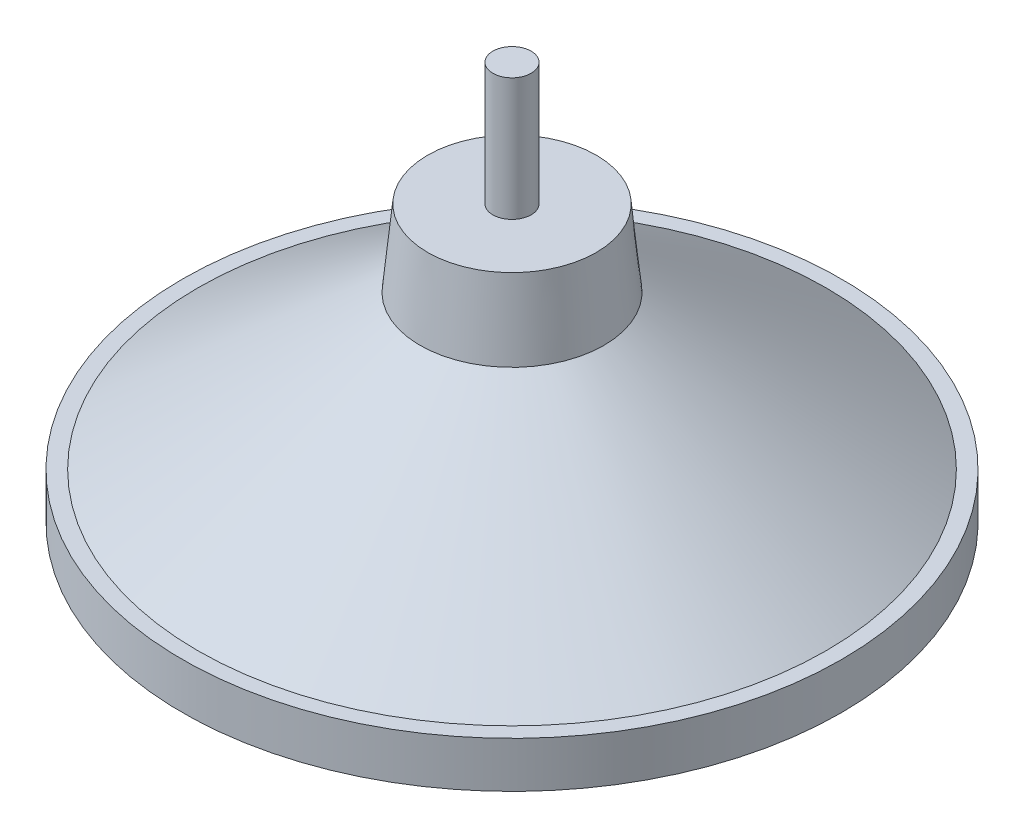
ISO-10303-21;
HEADER;
FILE_DESCRIPTION(('STEP AP214'),'2;1');
FILE_NAME('part.step','',(''),(''),'','','');
FILE_SCHEMA(('AUTOMOTIVE_DESIGN { 1 0 10303 214 1 1 1 1 }'));
ENDSEC;
DATA;
#1=APPLICATION_CONTEXT('core data for automotive mechanical design processes');
#2=APPLICATION_PROTOCOL_DEFINITION('international standard','automotive_design',2000,#1);
#3=PRODUCT_CONTEXT('',#1,'mechanical');
#4=PRODUCT('Part','Part','',(#3));
#5=PRODUCT_RELATED_PRODUCT_CATEGORY('part','',(#4));
#6=PRODUCT_DEFINITION_FORMATION('','',#4);
#7=PRODUCT_DEFINITION_CONTEXT('part definition',#1,'design');
#8=PRODUCT_DEFINITION('design','',#6,#7);
#9=PRODUCT_DEFINITION_SHAPE('','',#8);
#10=(LENGTH_UNIT() NAMED_UNIT(*) SI_UNIT(.MILLI.,.METRE.));
#11=(NAMED_UNIT(*) PLANE_ANGLE_UNIT() SI_UNIT($,.RADIAN.));
#12=(NAMED_UNIT(*) SI_UNIT($,.STERADIAN.) SOLID_ANGLE_UNIT());
#13=UNCERTAINTY_MEASURE_WITH_UNIT(LENGTH_MEASURE(1.E-05),#10,'distance_accuracy_value','');
#14=(GEOMETRIC_REPRESENTATION_CONTEXT(3) GLOBAL_UNCERTAINTY_ASSIGNED_CONTEXT((#13)) GLOBAL_UNIT_ASSIGNED_CONTEXT((#10,
#11,#12)) REPRESENTATION_CONTEXT('',''));
#15=CARTESIAN_POINT('',(0.,0.,0.));
#16=DIRECTION('',(0.,0.,1.));
#17=DIRECTION('',(1.,0.,0.));
#18=AXIS2_PLACEMENT_3D('',#15,#16,#17);
#19=CARTESIAN_POINT('',(0.,0.,0.));
#20=DIRECTION('',(0.,1.,0.));
#21=DIRECTION('',(-1.,0.,0.));
#22=AXIS2_PLACEMENT_3D('',#19,#20,#21);
#23=PLANE('',#22);
#24=CARTESIAN_POINT('',(0.,0.,0.));
#25=DIRECTION('',(0.,1.,0.));
#26=DIRECTION('',(-1.,0.,0.));
#27=AXIS2_PLACEMENT_3D('',#24,#25,#26);
#28=CIRCLE('',#27,68.2625);
#29=CARTESIAN_POINT('',(-68.2625,0.,0.));
#30=VERTEX_POINT('',#29);
#31=EDGE_CURVE('E10',#30,#30,#28,.T.);
#32=ORIENTED_EDGE('',*,*,#31,.F.);
#33=EDGE_LOOP('',(#32));
#34=FACE_BOUND('',#33,.T.);
#35=ADVANCED_FACE('F32',(#34),#23,.F.);
#36=CARTESIAN_POINT('',(0.,57.15,0.));
#37=DIRECTION('',(0.,1.,0.));
#38=DIRECTION('',(-1.,0.,0.));
#39=AXIS2_PLACEMENT_3D('',#36,#37,#38);
#40=CYLINDRICAL_SURFACE('',#39,68.2625);
#41=CARTESIAN_POINT('',(0.,9.525,0.));
#42=DIRECTION('',(0.,1.,0.));
#43=DIRECTION('',(-1.,0.,0.));
#44=AXIS2_PLACEMENT_3D('',#41,#42,#43);
#45=CIRCLE('',#44,68.2625);
#46=CARTESIAN_POINT('',(-68.2625,9.525,0.));
#47=VERTEX_POINT('',#46);
#48=EDGE_CURVE('E38',#47,#47,#45,.T.);
#49=ORIENTED_EDGE('',*,*,#48,.F.);
#50=EDGE_LOOP('',(#49));
#51=FACE_BOUND('',#50,.T.);
#52=ORIENTED_EDGE('',*,*,#31,.T.);
#53=EDGE_LOOP('',(#52));
#54=FACE_BOUND('',#53,.T.);
#55=ADVANCED_FACE('F89',(#51,#54),#40,.T.);
#56=CARTESIAN_POINT('',(68.2625,9.525,0.));
#57=DIRECTION('',(0.,-1.,0.));
#58=DIRECTION('',(1.,0.,0.));
#59=AXIS2_PLACEMENT_3D('',#56,#57,#58);
#60=PLANE('',#59);
#61=CARTESIAN_POINT('',(0.,9.525,0.));
#62=DIRECTION('',(0.,1.,0.));
#63=DIRECTION('',(-1.,0.,0.));
#64=AXIS2_PLACEMENT_3D('',#61,#62,#63);
#65=CIRCLE('',#64,65.0875);
#66=CARTESIAN_POINT('',(65.0875,9.525,0.));
#67=VERTEX_POINT('',#66);
#68=EDGE_CURVE('E42',#67,#67,#65,.T.);
#69=ORIENTED_EDGE('',*,*,#68,.F.);
#70=EDGE_LOOP('',(#69));
#71=FACE_BOUND('',#70,.T.);
#72=ORIENTED_EDGE('',*,*,#48,.T.);
#73=EDGE_LOOP('',(#72));
#74=FACE_BOUND('',#73,.T.);
#75=ADVANCED_FACE('F84',(#71,#74),#60,.F.);
#76=CARTESIAN_POINT('',(0.,9.525,0.));
#77=DIRECTION('',(0.,-1.,0.));
#78=DIRECTION('',(1.,0.,0.));
#79=AXIS2_PLACEMENT_3D('',#76,#77,#78);
#80=CONICAL_SURFACE('',#79,65.0875,0.96704699339746);
#81=CARTESIAN_POINT('',(0.,41.275,0.));
#82=DIRECTION('',(0.,1.,0.));
#83=DIRECTION('',(-1.,0.,0.));
#84=AXIS2_PLACEMENT_3D('',#81,#82,#83);
#85=CIRCLE('',#84,19.05);
#86=CARTESIAN_POINT('',(19.05,41.275,0.));
#87=VERTEX_POINT('',#86);
#88=EDGE_CURVE('E46',#87,#87,#85,.T.);
#89=CARTESIAN_POINT('',(19.05,41.275,0.));
#90=CARTESIAN_POINT('',(19.5295572916667,40.9442708333333,0.));
#91=CARTESIAN_POINT('',(20.0091145833333,40.6135416666667,0.));
#92=CARTESIAN_POINT('',(20.9682291666667,39.9520833333333,0.));
#93=CARTESIAN_POINT('',(21.4477864583333,39.6213541666666,0.));
#94=CARTESIAN_POINT('',(22.4069010416667,38.9598958333333,0.));
#95=CARTESIAN_POINT('',(22.8864583333333,38.6291666666667,0.));
#96=CARTESIAN_POINT('',(23.8455729166667,37.9677083333333,0.));
#97=CARTESIAN_POINT('',(24.3251302083333,37.6369791666667,0.));
#98=CARTESIAN_POINT('',(25.2842447916667,36.9755208333333,0.));
#99=CARTESIAN_POINT('',(25.7638020833333,36.6447916666667,0.));
#100=CARTESIAN_POINT('',(26.7229166666667,35.9833333333333,0.));
#101=CARTESIAN_POINT('',(27.2024739583333,35.6526041666667,0.));
#102=CARTESIAN_POINT('',(28.1615885416667,34.9911458333333,0.));
#103=CARTESIAN_POINT('',(28.6411458333333,34.6604166666667,0.));
#104=CARTESIAN_POINT('',(29.6002604166667,33.9989583333333,0.));
#105=CARTESIAN_POINT('',(30.0798177083333,33.6682291666667,0.));
#106=CARTESIAN_POINT('',(31.0389322916667,33.0067708333333,0.));
#107=CARTESIAN_POINT('',(31.5184895833333,32.6760416666667,0.));
#108=CARTESIAN_POINT('',(32.4776041666667,32.0145833333333,0.));
#109=CARTESIAN_POINT('',(32.9571614583333,31.6838541666667,0.));
#110=CARTESIAN_POINT('',(33.9162760416667,31.0223958333333,0.));
#111=CARTESIAN_POINT('',(34.3958333333333,30.6916666666667,0.));
#112=CARTESIAN_POINT('',(35.3549479166667,30.0302083333333,0.));
#113=CARTESIAN_POINT('',(35.8345052083333,29.6994791666667,0.));
#114=CARTESIAN_POINT('',(36.7936197916667,29.0380208333333,0.));
#115=CARTESIAN_POINT('',(37.2731770833333,28.7072916666667,0.));
#116=CARTESIAN_POINT('',(38.2322916666667,28.0458333333333,0.));
#117=CARTESIAN_POINT('',(38.7118489583333,27.7151041666667,0.));
#118=CARTESIAN_POINT('',(39.6709635416667,27.0536458333333,0.));
#119=CARTESIAN_POINT('',(40.1505208333333,26.7229166666667,0.));
#120=CARTESIAN_POINT('',(41.1096354166667,26.0614583333333,0.));
#121=CARTESIAN_POINT('',(41.5891927083333,25.7307291666667,0.));
#122=CARTESIAN_POINT('',(42.5483072916667,25.0692708333333,0.));
#123=CARTESIAN_POINT('',(43.0278645833333,24.7385416666667,0.));
#124=CARTESIAN_POINT('',(43.9869791666667,24.0770833333333,0.));
#125=CARTESIAN_POINT('',(44.4665364583333,23.7463541666667,0.));
#126=CARTESIAN_POINT('',(45.4256510416667,23.0848958333333,0.));
#127=CARTESIAN_POINT('',(45.9052083333333,22.7541666666667,0.));
#128=CARTESIAN_POINT('',(46.8643229166667,22.0927083333333,0.));
#129=CARTESIAN_POINT('',(47.3438802083333,21.7619791666667,0.));
#130=CARTESIAN_POINT('',(48.3029947916667,21.1005208333333,0.));
#131=CARTESIAN_POINT('',(48.7825520833333,20.7697916666667,0.));
#132=CARTESIAN_POINT('',(49.7416666666667,20.1083333333333,0.));
#133=CARTESIAN_POINT('',(50.2212239583333,19.7776041666667,0.));
#134=CARTESIAN_POINT('',(51.1803385416667,19.1161458333333,0.));
#135=CARTESIAN_POINT('',(51.6598958333333,18.7854166666667,0.));
#136=CARTESIAN_POINT('',(52.6190104166667,18.1239583333333,0.));
#137=CARTESIAN_POINT('',(53.0985677083333,17.7932291666667,0.));
#138=CARTESIAN_POINT('',(54.0576822916667,17.1317708333333,0.));
#139=CARTESIAN_POINT('',(54.5372395833333,16.8010416666667,0.));
#140=CARTESIAN_POINT('',(55.4963541666667,16.1395833333333,0.));
#141=CARTESIAN_POINT('',(55.9759114583333,15.8088541666667,0.));
#142=CARTESIAN_POINT('',(56.9350260416667,15.1473958333333,0.));
#143=CARTESIAN_POINT('',(57.4145833333333,14.8166666666667,0.));
#144=CARTESIAN_POINT('',(58.3736979166667,14.1552083333333,0.));
#145=CARTESIAN_POINT('',(58.8532552083333,13.8244791666667,0.));
#146=CARTESIAN_POINT('',(59.8123697916667,13.1630208333333,0.));
#147=CARTESIAN_POINT('',(60.2919270833333,12.8322916666667,0.));
#148=CARTESIAN_POINT('',(61.2510416666667,12.1708333333333,0.));
#149=CARTESIAN_POINT('',(61.7305989583333,11.8401041666667,0.));
#150=CARTESIAN_POINT('',(62.6897135416667,11.1786458333333,0.));
#151=CARTESIAN_POINT('',(63.1692708333333,10.8479166666667,0.));
#152=CARTESIAN_POINT('',(64.1283854166667,10.1864583333333,0.));
#153=CARTESIAN_POINT('',(64.6079427083333,9.85572916666667,0.));
#154=CARTESIAN_POINT('',(65.0875,9.525,0.));
#155=B_SPLINE_CURVE_WITH_KNOTS('',3,(#89,#90,#91,#92,#93,#94,#95,#96,#97,#98,#99,#100,#101,#102,
#103,#104,#105,#106,#107,#108,#109,#110,#111,#112,#113,#114,#115,#116,#117,#118,#119,#120,#121,
#122,#123,#124,#125,#126,#127,#128,#129,#130,#131,#132,#133,#134,#135,#136,#137,#138,#139,#140,
#141,#142,#143,#144,#145,#146,#147,#148,#149,#150,#151,#152,#153,#154),.UNSPECIFIED.,.F.,.F.,(4,
2,2,2,2,2,2,2,2,2,2,2,2,2,2,2,2,2,2,2,2,2,2,2,2,2,2,2,2,2,2,2,4),(0.,1.74763062432319,
3.49526124864639,5.24289187296957,6.99052249729276,8.73815312161595,10.4857837459391,
12.2334143702623,13.9810449945855,15.7286756189087,17.4763062432319,19.2239368675551,
20.9715674918783,22.7191981162015,24.4668287405247,26.2144593648479,27.962089989171,
29.7097206134942,31.4573512378174,33.2049818621406,34.9526124864638,36.700243110787,
38.4478737351102,40.1955043594334,41.9431349837566,43.6907656080798,45.438396232403,
47.1860268567262,48.9336574810493,50.6812881053725,52.4289187296957,54.1765493540189,
55.9241799783421),.UNSPECIFIED.);
#156=EDGE_CURVE('BSEAM78',#87,#67,#155,.T.);
#157=ORIENTED_EDGE('',*,*,#88,.F.);
#158=ORIENTED_EDGE('',*,*,#68,.T.);
#159=ORIENTED_EDGE('',*,*,#156,.T.);
#160=ORIENTED_EDGE('',*,*,#156,.F.);
#161=EDGE_LOOP('',(#157,#159,#158,#160));
#162=FACE_BOUND('',#161,.T.);
#163=ADVANCED_FACE('F78',(#162),#80,.T.);
#164=CARTESIAN_POINT('',(0.,41.275,0.));
#165=DIRECTION('',(0.,-1.,0.));
#166=DIRECTION('',(1.,0.,0.));
#167=AXIS2_PLACEMENT_3D('',#164,#165,#166);
#168=CONICAL_SURFACE('',#167,19.05,0.0996686524911621);
#169=CARTESIAN_POINT('',(0.,57.15,0.));
#170=DIRECTION('',(0.,1.,0.));
#171=DIRECTION('',(-1.,0.,0.));
#172=AXIS2_PLACEMENT_3D('',#169,#170,#171);
#173=CIRCLE('',#172,17.4625);
#174=CARTESIAN_POINT('',(-17.4625,57.15,0.));
#175=VERTEX_POINT('',#174);
#176=EDGE_CURVE('E51',#175,#175,#173,.T.);
#177=ORIENTED_EDGE('',*,*,#176,.F.);
#178=EDGE_LOOP('',(#177));
#179=FACE_BOUND('',#178,.T.);
#180=ORIENTED_EDGE('',*,*,#88,.T.);
#181=EDGE_LOOP('',(#180));
#182=FACE_BOUND('',#181,.T.);
#183=ADVANCED_FACE('F72',(#179,#182),#168,.T.);
#184=CARTESIAN_POINT('',(17.4625,57.15,0.));
#185=DIRECTION('',(0.,-1.,0.));
#186=DIRECTION('',(1.,0.,0.));
#187=AXIS2_PLACEMENT_3D('',#184,#185,#186);
#188=PLANE('',#187);
#189=CARTESIAN_POINT('',(0.,57.15,0.));
#190=DIRECTION('',(0.,1.,0.));
#191=DIRECTION('',(-1.,0.,0.));
#192=AXIS2_PLACEMENT_3D('',#189,#190,#191);
#193=CIRCLE('',#192,3.96875);
#194=CARTESIAN_POINT('',(-3.96875,57.15,0.));
#195=VERTEX_POINT('',#194);
#196=EDGE_CURVE('E54',#195,#195,#193,.T.);
#197=ORIENTED_EDGE('',*,*,#196,.F.);
#198=EDGE_LOOP('',(#197));
#199=FACE_BOUND('',#198,.T.);
#200=ORIENTED_EDGE('',*,*,#176,.T.);
#201=EDGE_LOOP('',(#200));
#202=FACE_BOUND('',#201,.T.);
#203=ADVANCED_FACE('F66',(#199,#202),#188,.F.);
#204=CARTESIAN_POINT('',(0.,57.15,0.));
#205=DIRECTION('',(0.,1.,0.));
#206=DIRECTION('',(-1.,0.,0.));
#207=AXIS2_PLACEMENT_3D('',#204,#205,#206);
#208=CYLINDRICAL_SURFACE('',#207,3.96875);
#209=CARTESIAN_POINT('',(0.,82.55,0.));
#210=DIRECTION('',(0.,1.,0.));
#211=DIRECTION('',(-1.,0.,0.));
#212=AXIS2_PLACEMENT_3D('',#209,#210,#211);
#213=CIRCLE('',#212,3.96875);
#214=CARTESIAN_POINT('',(-3.96875,82.55,0.));
#215=VERTEX_POINT('',#214);
#216=EDGE_CURVE('E57',#215,#215,#213,.T.);
#217=ORIENTED_EDGE('',*,*,#216,.F.);
#218=EDGE_LOOP('',(#217));
#219=FACE_BOUND('',#218,.T.);
#220=ORIENTED_EDGE('',*,*,#196,.T.);
#221=EDGE_LOOP('',(#220));
#222=FACE_BOUND('',#221,.T.);
#223=ADVANCED_FACE('F63',(#219,#222),#208,.T.);
#224=CARTESIAN_POINT('',(3.96875,82.55,0.));
#225=DIRECTION('',(0.,-1.,0.));
#226=DIRECTION('',(1.,0.,0.));
#227=AXIS2_PLACEMENT_3D('',#224,#225,#226);
#228=PLANE('',#227);
#229=ORIENTED_EDGE('',*,*,#216,.T.);
#230=EDGE_LOOP('',(#229));
#231=FACE_BOUND('',#230,.T.);
#232=ADVANCED_FACE('F61',(#231),#228,.F.);
#233=CLOSED_SHELL('',(#35,#55,#75,#163,#183,#203,#223,#232));
#234=MANIFOLD_SOLID_BREP('B2',#233);
#235=ADVANCED_BREP_SHAPE_REPRESENTATION('',(#18,#234),#14);
#236=SHAPE_DEFINITION_REPRESENTATION(#9,#235);
ENDSEC;
END-ISO-10303-21;
